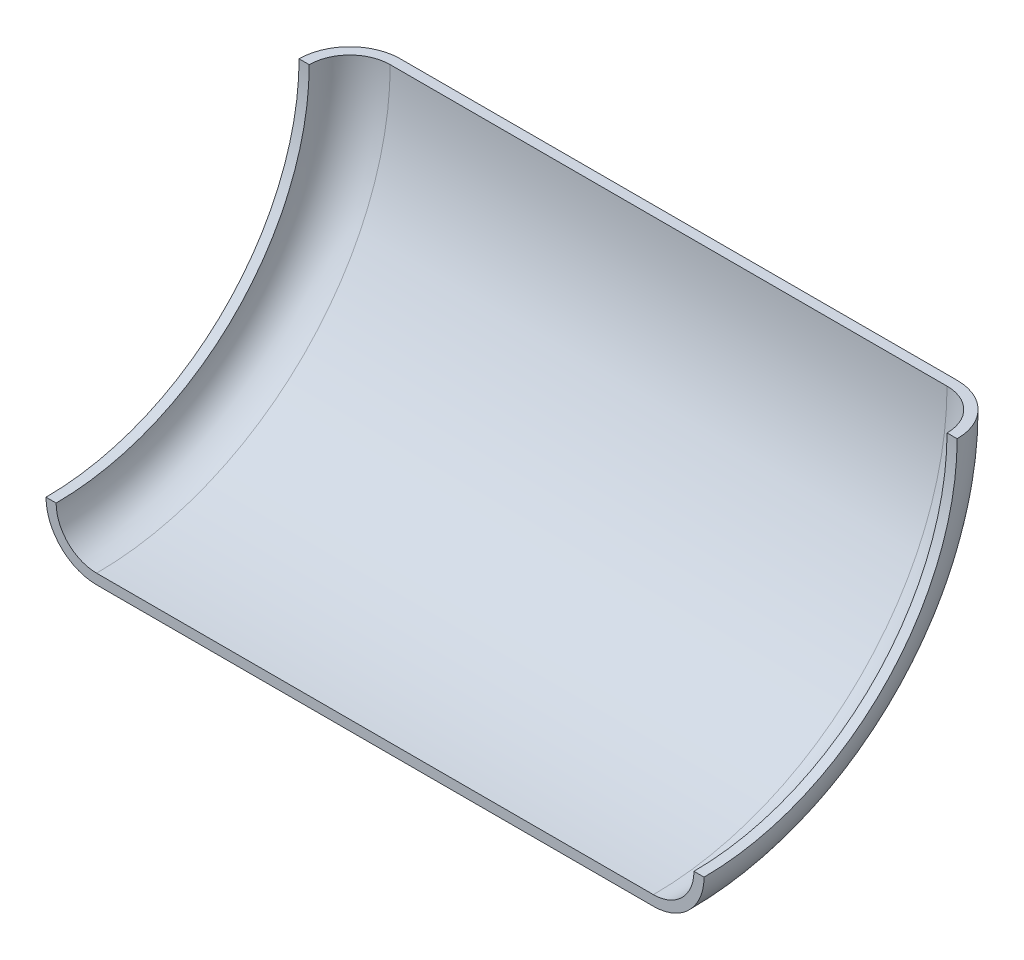
ISO-10303-21;
HEADER;
FILE_DESCRIPTION(('STEP AP214'),'2;1');
FILE_NAME('part.step','',(''),(''),'','','');
FILE_SCHEMA(('AUTOMOTIVE_DESIGN { 1 0 10303 214 1 1 1 1 }'));
ENDSEC;
DATA;
#1=APPLICATION_CONTEXT('core data for automotive mechanical design processes');
#2=APPLICATION_PROTOCOL_DEFINITION('international standard','automotive_design',2000,#1);
#3=PRODUCT_CONTEXT('',#1,'mechanical');
#4=PRODUCT('Part','Part','',(#3));
#5=PRODUCT_RELATED_PRODUCT_CATEGORY('part','',(#4));
#6=PRODUCT_DEFINITION_FORMATION('','',#4);
#7=PRODUCT_DEFINITION_CONTEXT('part definition',#1,'design');
#8=PRODUCT_DEFINITION('design','',#6,#7);
#9=PRODUCT_DEFINITION_SHAPE('','',#8);
#10=(LENGTH_UNIT() NAMED_UNIT(*) SI_UNIT(.MILLI.,.METRE.));
#11=(NAMED_UNIT(*) PLANE_ANGLE_UNIT() SI_UNIT($,.RADIAN.));
#12=(NAMED_UNIT(*) SI_UNIT($,.STERADIAN.) SOLID_ANGLE_UNIT());
#13=UNCERTAINTY_MEASURE_WITH_UNIT(LENGTH_MEASURE(1.E-05),#10,'distance_accuracy_value','');
#14=(GEOMETRIC_REPRESENTATION_CONTEXT(3) GLOBAL_UNCERTAINTY_ASSIGNED_CONTEXT((#13)) GLOBAL_UNIT_ASSIGNED_CONTEXT((#10,
#11,#12)) REPRESENTATION_CONTEXT('',''));
#15=CARTESIAN_POINT('',(0.,0.,0.));
#16=DIRECTION('',(0.,0.,1.));
#17=DIRECTION('',(1.,0.,0.));
#18=AXIS2_PLACEMENT_3D('',#15,#16,#17);
#19=CARTESIAN_POINT('',(-69.85,12.7,0.));
#20=DIRECTION('',(0.,0.,-1.));
#21=DIRECTION('',(-1.,0.,0.));
#22=AXIS2_PLACEMENT_3D('',#19,#20,#21);
#23=PLANE('',#22);
#24=CARTESIAN_POINT('',(-69.85,12.7,0.));
#25=DIRECTION('',(0.,0.,-1.));
#26=DIRECTION('',(-1.,0.,0.));
#27=AXIS2_PLACEMENT_3D('',#24,#25,#26);
#28=CIRCLE('',#27,10.16);
#29=CARTESIAN_POINT('',(-69.85,2.54,0.));
#30=VERTEX_POINT('',#29);
#31=CARTESIAN_POINT('',(-80.01,12.7,0.));
#32=VERTEX_POINT('',#31);
#33=EDGE_CURVE('E69',#30,#32,#28,.T.);
#34=ORIENTED_EDGE('',*,*,#33,.T.);
#35=DIRECTION('',(1.,0.,0.));
#36=VECTOR('',#35,1.);
#37=CARTESIAN_POINT('',(-82.55,12.7,0.));
#38=LINE('',#37,#36);
#39=CARTESIAN_POINT('',(-82.55,12.7,0.));
#40=VERTEX_POINT('',#39);
#41=EDGE_CURVE('E110',#32,#40,#38,.F.);
#42=ORIENTED_EDGE('',*,*,#41,.T.);
#43=CARTESIAN_POINT('',(-69.85,12.7,0.));
#44=DIRECTION('',(0.,0.,-1.));
#45=DIRECTION('',(-1.,0.,0.));
#46=AXIS2_PLACEMENT_3D('',#43,#44,#45);
#47=CIRCLE('',#46,12.7);
#48=CARTESIAN_POINT('',(-69.85,0.,0.));
#49=VERTEX_POINT('',#48);
#50=EDGE_CURVE('E117',#40,#49,#47,.F.);
#51=ORIENTED_EDGE('',*,*,#50,.T.);
#52=DIRECTION('',(1.,0.,0.));
#53=VECTOR('',#52,1.);
#54=CARTESIAN_POINT('',(-69.85,0.,0.));
#55=LINE('',#54,#53);
#56=CARTESIAN_POINT('',(69.85,0.,0.));
#57=VERTEX_POINT('',#56);
#58=EDGE_CURVE('E127',#49,#57,#55,.T.);
#59=ORIENTED_EDGE('',*,*,#58,.T.);
#60=CARTESIAN_POINT('',(69.85,12.7,0.));
#61=DIRECTION('',(0.,0.,1.));
#62=DIRECTION('',(1.,0.,0.));
#63=AXIS2_PLACEMENT_3D('',#60,#61,#62);
#64=CIRCLE('',#63,12.7);
#65=CARTESIAN_POINT('',(82.55,12.7,0.));
#66=VERTEX_POINT('',#65);
#67=EDGE_CURVE('E136',#57,#66,#64,.T.);
#68=ORIENTED_EDGE('',*,*,#67,.T.);
#69=DIRECTION('',(-1.,0.,0.));
#70=VECTOR('',#69,1.);
#71=CARTESIAN_POINT('',(82.55,12.7,0.));
#72=LINE('',#71,#70);
#73=CARTESIAN_POINT('',(80.01,12.7,0.));
#74=VERTEX_POINT('',#73);
#75=EDGE_CURVE('E144',#66,#74,#72,.T.);
#76=ORIENTED_EDGE('',*,*,#75,.T.);
#77=CARTESIAN_POINT('',(69.85,12.7,0.));
#78=DIRECTION('',(0.,0.,1.));
#79=DIRECTION('',(1.,0.,0.));
#80=AXIS2_PLACEMENT_3D('',#77,#78,#79);
#81=CIRCLE('',#80,10.16);
#82=CARTESIAN_POINT('',(69.85,2.54,0.));
#83=VERTEX_POINT('',#82);
#84=EDGE_CURVE('E80',#74,#83,#81,.F.);
#85=ORIENTED_EDGE('',*,*,#84,.T.);
#86=DIRECTION('',(1.,0.,0.));
#87=VECTOR('',#86,1.);
#88=CARTESIAN_POINT('',(-69.85,2.54,0.));
#89=LINE('',#88,#87);
#90=EDGE_CURVE('E75',#83,#30,#89,.F.);
#91=ORIENTED_EDGE('',*,*,#90,.T.);
#92=EDGE_LOOP('',(#34,#42,#51,#59,#68,#76,#85,#91));
#93=FACE_BOUND('',#92,.T.);
#94=ADVANCED_FACE('F33',(#93),#23,.F.);
#95=CARTESIAN_POINT('',(-69.85,76.2000000000002,-63.5));
#96=DIRECTION('',(0.,1.,0.));
#97=DIRECTION('',(-1.,0.,0.));
#98=AXIS2_PLACEMENT_3D('',#95,#96,#97);
#99=PLANE('',#98);
#100=CARTESIAN_POINT('',(-69.85,76.2000000000002,-63.5));
#101=DIRECTION('',(0.,1.,0.));
#102=DIRECTION('',(-1.,0.,0.));
#103=AXIS2_PLACEMENT_3D('',#100,#101,#102);
#104=CIRCLE('',#103,10.16);
#105=CARTESIAN_POINT('',(-69.85,76.2000000000001,-73.66));
#106=VERTEX_POINT('',#105);
#107=CARTESIAN_POINT('',(-80.01,76.2000000000002,-63.5));
#108=VERTEX_POINT('',#107);
#109=EDGE_CURVE('E11',#106,#108,#104,.T.);
#110=ORIENTED_EDGE('',*,*,#109,.F.);
#111=DIRECTION('',(1.,0.,0.));
#112=VECTOR('',#111,1.);
#113=CARTESIAN_POINT('',(-69.85,76.2000000000001,-73.66));
#114=LINE('',#113,#112);
#115=CARTESIAN_POINT('',(69.85,76.2000000000001,-73.66));
#116=VERTEX_POINT('',#115);
#117=EDGE_CURVE('E47',#116,#106,#114,.F.);
#118=ORIENTED_EDGE('',*,*,#117,.F.);
#119=CARTESIAN_POINT('',(69.85,76.2000000000002,-63.5));
#120=DIRECTION('',(0.,-1.,0.));
#121=DIRECTION('',(1.,0.,0.));
#122=AXIS2_PLACEMENT_3D('',#119,#120,#121);
#123=CIRCLE('',#122,10.16);
#124=CARTESIAN_POINT('',(80.01,76.2000000000002,-63.5));
#125=VERTEX_POINT('',#124);
#126=EDGE_CURVE('E56',#125,#116,#123,.F.);
#127=ORIENTED_EDGE('',*,*,#126,.F.);
#128=DIRECTION('',(-1.,0.,0.));
#129=VECTOR('',#128,1.);
#130=CARTESIAN_POINT('',(82.55,76.2000000000002,-63.5));
#131=LINE('',#130,#129);
#132=CARTESIAN_POINT('',(82.55,76.2000000000002,-63.5));
#133=VERTEX_POINT('',#132);
#134=EDGE_CURVE('E149',#133,#125,#131,.T.);
#135=ORIENTED_EDGE('',*,*,#134,.F.);
#136=CARTESIAN_POINT('',(69.85,76.2000000000002,-63.5));
#137=DIRECTION('',(0.,-1.,0.));
#138=DIRECTION('',(1.,0.,0.));
#139=AXIS2_PLACEMENT_3D('',#136,#137,#138);
#140=CIRCLE('',#139,12.7);
#141=CARTESIAN_POINT('',(69.85,76.2000000000001,-76.2));
#142=VERTEX_POINT('',#141);
#143=EDGE_CURVE('E141',#142,#133,#140,.T.);
#144=ORIENTED_EDGE('',*,*,#143,.F.);
#145=DIRECTION('',(1.,0.,0.));
#146=VECTOR('',#145,1.);
#147=CARTESIAN_POINT('',(-69.85,76.2000000000001,-76.2));
#148=LINE('',#147,#146);
#149=CARTESIAN_POINT('',(-69.85,76.2000000000001,-76.2));
#150=VERTEX_POINT('',#149);
#151=EDGE_CURVE('E133',#150,#142,#148,.T.);
#152=ORIENTED_EDGE('',*,*,#151,.F.);
#153=CARTESIAN_POINT('',(-69.85,76.2000000000002,-63.5));
#154=DIRECTION('',(0.,1.,0.));
#155=DIRECTION('',(-1.,0.,0.));
#156=AXIS2_PLACEMENT_3D('',#153,#154,#155);
#157=CIRCLE('',#156,12.7);
#158=CARTESIAN_POINT('',(-82.55,76.2000000000002,-63.5));
#159=VERTEX_POINT('',#158);
#160=EDGE_CURVE('E128',#159,#150,#157,.F.);
#161=ORIENTED_EDGE('',*,*,#160,.F.);
#162=DIRECTION('',(1.,0.,0.));
#163=VECTOR('',#162,1.);
#164=CARTESIAN_POINT('',(-82.55,76.2000000000002,-63.5));
#165=LINE('',#164,#163);
#166=EDGE_CURVE('E121',#108,#159,#165,.F.);
#167=ORIENTED_EDGE('',*,*,#166,.F.);
#168=EDGE_LOOP('',(#110,#118,#127,#135,#144,#152,#161,#167));
#169=FACE_BOUND('',#168,.T.);
#170=ADVANCED_FACE('F172',(#169),#99,.T.);
#171=CARTESIAN_POINT('',(0.,76.2000000000001,1.31838984174237E-13));
#172=DIRECTION('',(1.,0.,0.));
#173=DIRECTION('',(0.,0.,-1.));
#174=AXIS2_PLACEMENT_3D('',#171,#172,#173);
#175=CYLINDRICAL_SURFACE('',#174,63.5000000000001);
#176=CARTESIAN_POINT('',(-82.55,76.2000000000001,1.31838984174237E-13));
#177=DIRECTION('',(1.,0.,0.));
#178=DIRECTION('',(0.,-1.,0.));
#179=AXIS2_PLACEMENT_3D('',#176,#177,#178);
#180=CIRCLE('',#179,63.5000000000001);
#181=EDGE_CURVE('E114',#40,#159,#180,.T.);
#182=ORIENTED_EDGE('',*,*,#181,.F.);
#183=ORIENTED_EDGE('',*,*,#41,.F.);
#184=CARTESIAN_POINT('',(-80.01,76.2000000000001,1.31838984174237E-13));
#185=DIRECTION('',(1.,0.,0.));
#186=DIRECTION('',(0.,-1.,0.));
#187=AXIS2_PLACEMENT_3D('',#184,#185,#186);
#188=CIRCLE('',#187,63.5000000000001);
#189=EDGE_CURVE('E112',#32,#108,#188,.T.);
#190=ORIENTED_EDGE('',*,*,#189,.T.);
#191=ORIENTED_EDGE('',*,*,#166,.T.);
#192=EDGE_LOOP('',(#182,#183,#190,#191));
#193=FACE_BOUND('',#192,.T.);
#194=ADVANCED_FACE('F111',(#193),#175,.F.);
#195=CARTESIAN_POINT('',(-69.85,76.2000000000001,1.31838984174237E-13));
#196=DIRECTION('',(1.,0.,0.));
#197=DIRECTION('',(0.,0.,-1.));
#198=AXIS2_PLACEMENT_3D('',#195,#196,#197);
#199=TOROIDAL_SURFACE('',#198,63.5000000000001,12.7);
#200=CARTESIAN_POINT('',(-69.85,76.2000000000001,1.31838984174237E-13));
#201=DIRECTION('',(1.,0.,0.));
#202=DIRECTION('',(0.,-1.,0.));
#203=AXIS2_PLACEMENT_3D('',#200,#201,#202);
#204=CIRCLE('',#203,76.2000000000001);
#205=EDGE_CURVE('E130',#49,#150,#204,.T.);
#206=ORIENTED_EDGE('',*,*,#205,.F.);
#207=ORIENTED_EDGE('',*,*,#50,.F.);
#208=ORIENTED_EDGE('',*,*,#181,.T.);
#209=ORIENTED_EDGE('',*,*,#160,.T.);
#210=EDGE_LOOP('',(#206,#207,#208,#209));
#211=FACE_BOUND('',#210,.T.);
#212=ADVANCED_FACE('F179',(#211),#199,.T.);
#213=CARTESIAN_POINT('',(0.,76.2000000000001,1.31838984174237E-13));
#214=DIRECTION('',(1.,0.,0.));
#215=DIRECTION('',(0.,0.,-1.));
#216=AXIS2_PLACEMENT_3D('',#213,#214,#215);
#217=CYLINDRICAL_SURFACE('',#216,76.2000000000001);
#218=CARTESIAN_POINT('',(69.85,76.2000000000001,1.31838984174237E-13));
#219=DIRECTION('',(1.,0.,0.));
#220=DIRECTION('',(0.,-1.,0.));
#221=AXIS2_PLACEMENT_3D('',#218,#219,#220);
#222=CIRCLE('',#221,76.2000000000001);
#223=EDGE_CURVE('E138',#57,#142,#222,.T.);
#224=ORIENTED_EDGE('',*,*,#223,.F.);
#225=ORIENTED_EDGE('',*,*,#58,.F.);
#226=ORIENTED_EDGE('',*,*,#205,.T.);
#227=ORIENTED_EDGE('',*,*,#151,.T.);
#228=EDGE_LOOP('',(#224,#225,#226,#227));
#229=FACE_BOUND('',#228,.T.);
#230=ADVANCED_FACE('F189',(#229),#217,.T.);
#231=CARTESIAN_POINT('',(69.85,76.2000000000001,1.31838984174237E-13));
#232=DIRECTION('',(1.,0.,0.));
#233=DIRECTION('',(0.,0.,-1.));
#234=AXIS2_PLACEMENT_3D('',#231,#232,#233);
#235=TOROIDAL_SURFACE('',#234,63.5000000000001,12.7);
#236=CARTESIAN_POINT('',(82.55,76.2000000000001,1.31838984174237E-13));
#237=DIRECTION('',(1.,0.,0.));
#238=DIRECTION('',(0.,-1.,0.));
#239=AXIS2_PLACEMENT_3D('',#236,#237,#238);
#240=CIRCLE('',#239,63.5000000000001);
#241=EDGE_CURVE('E146',#66,#133,#240,.T.);
#242=ORIENTED_EDGE('',*,*,#241,.F.);
#243=ORIENTED_EDGE('',*,*,#67,.F.);
#244=ORIENTED_EDGE('',*,*,#223,.T.);
#245=ORIENTED_EDGE('',*,*,#143,.T.);
#246=EDGE_LOOP('',(#242,#243,#244,#245));
#247=FACE_BOUND('',#246,.T.);
#248=ADVANCED_FACE('F191',(#247),#235,.T.);
#249=CARTESIAN_POINT('',(0.,76.2000000000001,1.31838984174237E-13));
#250=DIRECTION('',(1.,0.,0.));
#251=DIRECTION('',(0.,0.,-1.));
#252=AXIS2_PLACEMENT_3D('',#249,#250,#251);
#253=CYLINDRICAL_SURFACE('',#252,63.5000000000001);
#254=CARTESIAN_POINT('',(80.01,76.2000000000001,1.31838984174237E-13));
#255=DIRECTION('',(1.,0.,0.));
#256=DIRECTION('',(0.,-1.,0.));
#257=AXIS2_PLACEMENT_3D('',#254,#255,#256);
#258=CIRCLE('',#257,63.5000000000001);
#259=EDGE_CURVE('E152',#74,#125,#258,.T.);
#260=ORIENTED_EDGE('',*,*,#259,.F.);
#261=ORIENTED_EDGE('',*,*,#75,.F.);
#262=ORIENTED_EDGE('',*,*,#241,.T.);
#263=ORIENTED_EDGE('',*,*,#134,.T.);
#264=EDGE_LOOP('',(#260,#261,#262,#263));
#265=FACE_BOUND('',#264,.T.);
#266=ADVANCED_FACE('F169',(#265),#253,.F.);
#267=CARTESIAN_POINT('',(69.85,76.2000000000001,1.31838984174237E-13));
#268=DIRECTION('',(1.,0.,0.));
#269=DIRECTION('',(0.,0.,-1.));
#270=AXIS2_PLACEMENT_3D('',#267,#268,#269);
#271=TOROIDAL_SURFACE('',#270,63.5000000000001,10.16);
#272=CARTESIAN_POINT('',(69.85,76.2000000000001,1.31838984174237E-13));
#273=DIRECTION('',(1.,0.,0.));
#274=DIRECTION('',(0.,-1.,0.));
#275=AXIS2_PLACEMENT_3D('',#272,#273,#274);
#276=CIRCLE('',#275,73.6600000000001);
#277=EDGE_CURVE('E156',#83,#116,#276,.T.);
#278=ORIENTED_EDGE('',*,*,#277,.F.);
#279=ORIENTED_EDGE('',*,*,#84,.F.);
#280=ORIENTED_EDGE('',*,*,#259,.T.);
#281=ORIENTED_EDGE('',*,*,#126,.T.);
#282=EDGE_LOOP('',(#278,#279,#280,#281));
#283=FACE_BOUND('',#282,.T.);
#284=ADVANCED_FACE('F162',(#283),#271,.F.);
#285=CARTESIAN_POINT('',(0.,76.2000000000001,1.31838984174237E-13));
#286=DIRECTION('',(1.,0.,0.));
#287=DIRECTION('',(0.,0.,-1.));
#288=AXIS2_PLACEMENT_3D('',#285,#286,#287);
#289=CYLINDRICAL_SURFACE('',#288,73.6600000000001);
#290=CARTESIAN_POINT('',(-69.85,76.2000000000001,1.31838984174237E-13));
#291=DIRECTION('',(1.,0.,0.));
#292=DIRECTION('',(0.,-1.,0.));
#293=AXIS2_PLACEMENT_3D('',#290,#291,#292);
#294=CIRCLE('',#293,73.6600000000001);
#295=EDGE_CURVE('E40',#30,#106,#294,.T.);
#296=ORIENTED_EDGE('',*,*,#295,.F.);
#297=ORIENTED_EDGE('',*,*,#90,.F.);
#298=ORIENTED_EDGE('',*,*,#277,.T.);
#299=ORIENTED_EDGE('',*,*,#117,.T.);
#300=EDGE_LOOP('',(#296,#297,#298,#299));
#301=FACE_BOUND('',#300,.T.);
#302=ADVANCED_FACE('F160',(#301),#289,.F.);
#303=CARTESIAN_POINT('',(-69.85,76.2000000000001,1.31838984174237E-13));
#304=DIRECTION('',(1.,0.,0.));
#305=DIRECTION('',(0.,0.,-1.));
#306=AXIS2_PLACEMENT_3D('',#303,#304,#305);
#307=TOROIDAL_SURFACE('',#306,63.5000000000001,10.16);
#308=ORIENTED_EDGE('',*,*,#109,.T.);
#309=ORIENTED_EDGE('',*,*,#189,.F.);
#310=ORIENTED_EDGE('',*,*,#33,.F.);
#311=ORIENTED_EDGE('',*,*,#295,.T.);
#312=EDGE_LOOP('',(#308,#309,#310,#311));
#313=FACE_BOUND('',#312,.T.);
#314=ADVANCED_FACE('F119',(#313),#307,.F.);
#315=CLOSED_SHELL('',(#94,#170,#194,#212,#230,#248,#266,#284,#302,#314));
#316=MANIFOLD_SOLID_BREP('B2',#315);
#317=ADVANCED_BREP_SHAPE_REPRESENTATION('',(#18,#316),#14);
#318=SHAPE_DEFINITION_REPRESENTATION(#9,#317);
ENDSEC;
END-ISO-10303-21;
